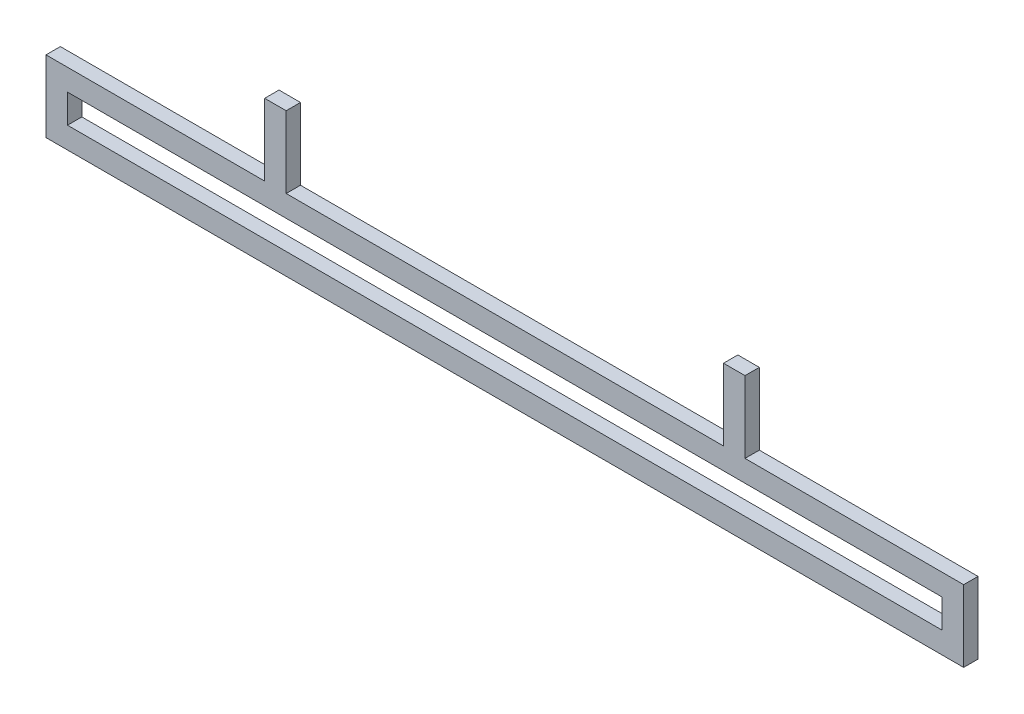
ISO-10303-21;
HEADER;
FILE_DESCRIPTION(('STEP AP214'),'2;1');
FILE_NAME('part.step','',(''),(''),'','','');
FILE_SCHEMA(('AUTOMOTIVE_DESIGN { 1 0 10303 214 1 1 1 1 }'));
ENDSEC;
DATA;
#1=APPLICATION_CONTEXT('core data for automotive mechanical design processes');
#2=APPLICATION_PROTOCOL_DEFINITION('international standard','automotive_design',2000,#1);
#3=PRODUCT_CONTEXT('',#1,'mechanical');
#4=PRODUCT('Part','Part','',(#3));
#5=PRODUCT_RELATED_PRODUCT_CATEGORY('part','',(#4));
#6=PRODUCT_DEFINITION_FORMATION('','',#4);
#7=PRODUCT_DEFINITION_CONTEXT('part definition',#1,'design');
#8=PRODUCT_DEFINITION('design','',#6,#7);
#9=PRODUCT_DEFINITION_SHAPE('','',#8);
#10=(LENGTH_UNIT() NAMED_UNIT(*) SI_UNIT(.MILLI.,.METRE.));
#11=(NAMED_UNIT(*) PLANE_ANGLE_UNIT() SI_UNIT($,.RADIAN.));
#12=(NAMED_UNIT(*) SI_UNIT($,.STERADIAN.) SOLID_ANGLE_UNIT());
#13=UNCERTAINTY_MEASURE_WITH_UNIT(LENGTH_MEASURE(1.E-05),#10,'distance_accuracy_value','');
#14=(GEOMETRIC_REPRESENTATION_CONTEXT(3) GLOBAL_UNCERTAINTY_ASSIGNED_CONTEXT((#13)) GLOBAL_UNIT_ASSIGNED_CONTEXT((#10,
#11,#12)) REPRESENTATION_CONTEXT('',''));
#15=CARTESIAN_POINT('',(0.,0.,0.));
#16=DIRECTION('',(0.,0.,1.));
#17=DIRECTION('',(1.,0.,0.));
#18=AXIS2_PLACEMENT_3D('',#15,#16,#17);
#19=CARTESIAN_POINT('',(0.,0.,10.));
#20=DIRECTION('',(0.,0.,1.));
#21=DIRECTION('',(1.,0.,0.));
#22=AXIS2_PLACEMENT_3D('',#19,#20,#21);
#23=PLANE('',#22);
#24=DIRECTION('',(0.,1.,0.));
#25=VECTOR('',#24,1.);
#26=CARTESIAN_POINT('',(0.,-145.36,10.));
#27=LINE('',#26,#25);
#28=CARTESIAN_POINT('',(0.,-145.36,10.));
#29=VERTEX_POINT('',#28);
#30=CARTESIAN_POINT('',(0.,-95.3599999999997,10.));
#31=VERTEX_POINT('',#30);
#32=EDGE_CURVE('E236',#29,#31,#27,.T.);
#33=ORIENTED_EDGE('',*,*,#32,.T.);
#34=DIRECTION('',(-1.,0.,0.));
#35=VECTOR('',#34,1.);
#36=CARTESIAN_POINT('',(0.,-95.3599999999997,10.));
#37=LINE('',#36,#35);
#38=CARTESIAN_POINT('',(-152.5,-95.3599999999997,10.));
#39=VERTEX_POINT('',#38);
#40=EDGE_CURVE('E241',#31,#39,#37,.T.);
#41=ORIENTED_EDGE('',*,*,#40,.T.);
#42=DIRECTION('',(0.,1.,0.));
#43=VECTOR('',#42,1.);
#44=CARTESIAN_POINT('',(-152.5,0.,10.));
#45=LINE('',#44,#43);
#46=CARTESIAN_POINT('',(-152.5,-45.3599999999996,10.));
#47=VERTEX_POINT('',#46);
#48=EDGE_CURVE('E213',#39,#47,#45,.T.);
#49=ORIENTED_EDGE('',*,*,#48,.T.);
#50=DIRECTION('',(-1.,0.,0.));
#51=VECTOR('',#50,1.);
#52=CARTESIAN_POINT('',(0.,-45.3599999999996,10.));
#53=LINE('',#52,#51);
#54=CARTESIAN_POINT('',(-167.5,-45.3599999999996,10.));
#55=VERTEX_POINT('',#54);
#56=EDGE_CURVE('E211',#47,#55,#53,.T.);
#57=ORIENTED_EDGE('',*,*,#56,.T.);
#58=DIRECTION('',(0.,1.,0.));
#59=VECTOR('',#58,1.);
#60=CARTESIAN_POINT('',(-167.5,0.,10.));
#61=LINE('',#60,#59);
#62=CARTESIAN_POINT('',(-167.5,-95.3599999999997,10.));
#63=VERTEX_POINT('',#62);
#64=EDGE_CURVE('E216',#63,#55,#61,.T.);
#65=ORIENTED_EDGE('',*,*,#64,.F.);
#66=CARTESIAN_POINT('',(-472.5,-95.3599999999997,10.));
#67=VERTEX_POINT('',#66);
#68=EDGE_CURVE('E245',#63,#67,#37,.T.);
#69=ORIENTED_EDGE('',*,*,#68,.T.);
#70=DIRECTION('',(0.,1.,0.));
#71=VECTOR('',#70,1.);
#72=CARTESIAN_POINT('',(-472.5,-95.3599999999997,10.));
#73=LINE('',#72,#71);
#74=CARTESIAN_POINT('',(-472.5,-45.3599999999996,10.));
#75=VERTEX_POINT('',#74);
#76=EDGE_CURVE('E207',#67,#75,#73,.T.);
#77=ORIENTED_EDGE('',*,*,#76,.T.);
#78=DIRECTION('',(1.,0.,0.));
#79=VECTOR('',#78,1.);
#80=CARTESIAN_POINT('',(-487.5,-45.3599999999996,10.));
#81=LINE('',#80,#79);
#82=CARTESIAN_POINT('',(-487.5,-45.3599999999996,10.));
#83=VERTEX_POINT('',#82);
#84=EDGE_CURVE('E198',#83,#75,#81,.T.);
#85=ORIENTED_EDGE('',*,*,#84,.F.);
#86=DIRECTION('',(0.,1.,0.));
#87=VECTOR('',#86,1.);
#88=CARTESIAN_POINT('',(-487.5,-95.3599999999997,10.));
#89=LINE('',#88,#87);
#90=CARTESIAN_POINT('',(-487.5,-95.3599999999997,10.));
#91=VERTEX_POINT('',#90);
#92=EDGE_CURVE('E186',#91,#83,#89,.T.);
#93=ORIENTED_EDGE('',*,*,#92,.F.);
#94=CARTESIAN_POINT('',(-640.,-95.3599999999997,10.));
#95=VERTEX_POINT('',#94);
#96=EDGE_CURVE('E239',#91,#95,#37,.T.);
#97=ORIENTED_EDGE('',*,*,#96,.T.);
#98=DIRECTION('',(0.,-1.,0.));
#99=VECTOR('',#98,1.);
#100=CARTESIAN_POINT('',(-640.,-145.36,10.));
#101=LINE('',#100,#99);
#102=CARTESIAN_POINT('',(-640.,-145.36,10.));
#103=VERTEX_POINT('',#102);
#104=EDGE_CURVE('E244',#95,#103,#101,.T.);
#105=ORIENTED_EDGE('',*,*,#104,.T.);
#106=DIRECTION('',(1.,0.,0.));
#107=VECTOR('',#106,1.);
#108=CARTESIAN_POINT('',(0.,-145.36,10.));
#109=LINE('',#108,#107);
#110=EDGE_CURVE('E247',#103,#29,#109,.T.);
#111=ORIENTED_EDGE('',*,*,#110,.T.);
#112=EDGE_LOOP('',(#33,#41,#49,#57,#65,#69,#77,#85,#93,#97,#105,#111));
#113=FACE_BOUND('',#112,.T.);
#114=DIRECTION('',(0.,-1.,0.));
#115=VECTOR('',#114,1.);
#116=CARTESIAN_POINT('',(-15.,-110.36,10.));
#117=LINE('',#116,#115);
#118=CARTESIAN_POINT('',(-15.,-110.36,10.));
#119=VERTEX_POINT('',#118);
#120=CARTESIAN_POINT('',(-15.,-130.36,10.));
#121=VERTEX_POINT('',#120);
#122=EDGE_CURVE('E157',#119,#121,#117,.T.);
#123=ORIENTED_EDGE('',*,*,#122,.T.);
#124=DIRECTION('',(1.,0.,0.));
#125=VECTOR('',#124,1.);
#126=CARTESIAN_POINT('',(-625.,-130.36,10.));
#127=LINE('',#126,#125);
#128=CARTESIAN_POINT('',(-625.,-130.36,10.));
#129=VERTEX_POINT('',#128);
#130=EDGE_CURVE('E148',#129,#121,#127,.T.);
#131=ORIENTED_EDGE('',*,*,#130,.F.);
#132=DIRECTION('',(0.,-1.,0.));
#133=VECTOR('',#132,1.);
#134=CARTESIAN_POINT('',(-625.,-110.36,10.));
#135=LINE('',#134,#133);
#136=CARTESIAN_POINT('',(-625.,-110.36,10.));
#137=VERTEX_POINT('',#136);
#138=EDGE_CURVE('E169',#137,#129,#135,.T.);
#139=ORIENTED_EDGE('',*,*,#138,.F.);
#140=DIRECTION('',(1.,0.,0.));
#141=VECTOR('',#140,1.);
#142=CARTESIAN_POINT('',(-625.,-110.36,10.));
#143=LINE('',#142,#141);
#144=EDGE_CURVE('E51',#137,#119,#143,.T.);
#145=ORIENTED_EDGE('',*,*,#144,.T.);
#146=EDGE_LOOP('',(#123,#131,#139,#145));
#147=FACE_BOUND('',#146,.T.);
#148=ADVANCED_FACE('F36',(#113,#147),#23,.T.);
#149=CARTESIAN_POINT('',(0.,0.,0.));
#150=DIRECTION('',(0.,0.,1.));
#151=DIRECTION('',(1.,0.,0.));
#152=AXIS2_PLACEMENT_3D('',#149,#150,#151);
#153=PLANE('',#152);
#154=DIRECTION('',(0.,1.,0.));
#155=VECTOR('',#154,1.);
#156=CARTESIAN_POINT('',(0.,-145.36,0.));
#157=LINE('',#156,#155);
#158=CARTESIAN_POINT('',(0.,-145.36,0.));
#159=VERTEX_POINT('',#158);
#160=CARTESIAN_POINT('',(0.,-95.3599999999997,0.));
#161=VERTEX_POINT('',#160);
#162=EDGE_CURVE('E228',#159,#161,#157,.T.);
#163=ORIENTED_EDGE('',*,*,#162,.F.);
#164=DIRECTION('',(1.,0.,0.));
#165=VECTOR('',#164,1.);
#166=CARTESIAN_POINT('',(0.,-145.36,0.));
#167=LINE('',#166,#165);
#168=CARTESIAN_POINT('',(-640.,-145.36,0.));
#169=VERTEX_POINT('',#168);
#170=EDGE_CURVE('E240',#169,#159,#167,.T.);
#171=ORIENTED_EDGE('',*,*,#170,.F.);
#172=DIRECTION('',(0.,-1.,0.));
#173=VECTOR('',#172,1.);
#174=CARTESIAN_POINT('',(-640.,-145.36,0.));
#175=LINE('',#174,#173);
#176=CARTESIAN_POINT('',(-640.,-95.3599999999997,0.));
#177=VERTEX_POINT('',#176);
#178=EDGE_CURVE('E256',#177,#169,#175,.T.);
#179=ORIENTED_EDGE('',*,*,#178,.F.);
#180=DIRECTION('',(-1.,0.,0.));
#181=VECTOR('',#180,1.);
#182=CARTESIAN_POINT('',(0.,-95.3599999999997,0.));
#183=LINE('',#182,#181);
#184=CARTESIAN_POINT('',(-487.5,-95.3599999999997,0.));
#185=VERTEX_POINT('',#184);
#186=EDGE_CURVE('E252',#185,#177,#183,.T.);
#187=ORIENTED_EDGE('',*,*,#186,.F.);
#188=DIRECTION('',(0.,1.,0.));
#189=VECTOR('',#188,1.);
#190=CARTESIAN_POINT('',(-487.5,-95.3599999999997,0.));
#191=LINE('',#190,#189);
#192=CARTESIAN_POINT('',(-487.5,-45.3599999999996,0.));
#193=VERTEX_POINT('',#192);
#194=EDGE_CURVE('E194',#185,#193,#191,.T.);
#195=ORIENTED_EDGE('',*,*,#194,.T.);
#196=DIRECTION('',(1.,0.,0.));
#197=VECTOR('',#196,1.);
#198=CARTESIAN_POINT('',(-487.5,-45.3599999999996,0.));
#199=LINE('',#198,#197);
#200=CARTESIAN_POINT('',(-472.5,-45.3599999999996,0.));
#201=VERTEX_POINT('',#200);
#202=EDGE_CURVE('E201',#193,#201,#199,.T.);
#203=ORIENTED_EDGE('',*,*,#202,.T.);
#204=DIRECTION('',(0.,1.,0.));
#205=VECTOR('',#204,1.);
#206=CARTESIAN_POINT('',(-472.5,-95.3599999999997,0.));
#207=LINE('',#206,#205);
#208=CARTESIAN_POINT('',(-472.5,-95.3599999999997,0.));
#209=VERTEX_POINT('',#208);
#210=EDGE_CURVE('E197',#209,#201,#207,.T.);
#211=ORIENTED_EDGE('',*,*,#210,.F.);
#212=CARTESIAN_POINT('',(-167.5,-95.3599999999997,0.));
#213=VERTEX_POINT('',#212);
#214=EDGE_CURVE('E257',#213,#209,#183,.T.);
#215=ORIENTED_EDGE('',*,*,#214,.F.);
#216=DIRECTION('',(0.,1.,0.));
#217=VECTOR('',#216,1.);
#218=CARTESIAN_POINT('',(-167.5,0.,0.));
#219=LINE('',#218,#217);
#220=CARTESIAN_POINT('',(-167.5,-45.3599999999996,0.));
#221=VERTEX_POINT('',#220);
#222=EDGE_CURVE('E214',#213,#221,#219,.T.);
#223=ORIENTED_EDGE('',*,*,#222,.T.);
#224=DIRECTION('',(-1.,0.,0.));
#225=VECTOR('',#224,1.);
#226=CARTESIAN_POINT('',(0.,-45.3599999999996,0.));
#227=LINE('',#226,#225);
#228=CARTESIAN_POINT('',(-152.5,-45.3599999999996,0.));
#229=VERTEX_POINT('',#228);
#230=EDGE_CURVE('E204',#229,#221,#227,.T.);
#231=ORIENTED_EDGE('',*,*,#230,.F.);
#232=DIRECTION('',(0.,1.,0.));
#233=VECTOR('',#232,1.);
#234=CARTESIAN_POINT('',(-152.5,0.,0.));
#235=LINE('',#234,#233);
#236=CARTESIAN_POINT('',(-152.5,-95.3599999999997,0.));
#237=VERTEX_POINT('',#236);
#238=EDGE_CURVE('E222',#237,#229,#235,.T.);
#239=ORIENTED_EDGE('',*,*,#238,.F.);
#240=EDGE_CURVE('E253',#161,#237,#183,.T.);
#241=ORIENTED_EDGE('',*,*,#240,.F.);
#242=EDGE_LOOP('',(#163,#171,#179,#187,#195,#203,#211,#215,#223,#231,#239,#241));
#243=FACE_BOUND('',#242,.T.);
#244=DIRECTION('',(1.,0.,0.));
#245=VECTOR('',#244,1.);
#246=CARTESIAN_POINT('',(-625.,-130.36,0.));
#247=LINE('',#246,#245);
#248=CARTESIAN_POINT('',(-625.,-130.36,0.));
#249=VERTEX_POINT('',#248);
#250=CARTESIAN_POINT('',(-15.,-130.36,0.));
#251=VERTEX_POINT('',#250);
#252=EDGE_CURVE('E59',#249,#251,#247,.T.);
#253=ORIENTED_EDGE('',*,*,#252,.T.);
#254=DIRECTION('',(0.,-1.,0.));
#255=VECTOR('',#254,1.);
#256=CARTESIAN_POINT('',(-15.,-110.36,0.));
#257=LINE('',#256,#255);
#258=CARTESIAN_POINT('',(-15.,-110.36,0.));
#259=VERTEX_POINT('',#258);
#260=EDGE_CURVE('E164',#259,#251,#257,.T.);
#261=ORIENTED_EDGE('',*,*,#260,.F.);
#262=DIRECTION('',(1.,0.,0.));
#263=VECTOR('',#262,1.);
#264=CARTESIAN_POINT('',(-625.,-110.36,0.));
#265=LINE('',#264,#263);
#266=CARTESIAN_POINT('',(-625.,-110.36,0.));
#267=VERTEX_POINT('',#266);
#268=EDGE_CURVE('E175',#267,#259,#265,.T.);
#269=ORIENTED_EDGE('',*,*,#268,.F.);
#270=DIRECTION('',(0.,-1.,0.));
#271=VECTOR('',#270,1.);
#272=CARTESIAN_POINT('',(-625.,-110.36,0.));
#273=LINE('',#272,#271);
#274=EDGE_CURVE('E158',#267,#249,#273,.T.);
#275=ORIENTED_EDGE('',*,*,#274,.T.);
#276=EDGE_LOOP('',(#253,#261,#269,#275));
#277=FACE_BOUND('',#276,.T.);
#278=ADVANCED_FACE('F275',(#243,#277),#153,.F.);
#279=CARTESIAN_POINT('',(0.,-95.3599999999997,10.));
#280=DIRECTION('',(0.,-1.,0.));
#281=DIRECTION('',(1.,0.,0.));
#282=AXIS2_PLACEMENT_3D('',#279,#280,#281);
#283=PLANE('',#282);
#284=DIRECTION('',(0.,0.,-1.));
#285=VECTOR('',#284,1.);
#286=CARTESIAN_POINT('',(-472.5,-95.3599999999997,10.));
#287=LINE('',#286,#285);
#288=EDGE_CURVE('E187',#67,#209,#287,.T.);
#289=ORIENTED_EDGE('',*,*,#288,.F.);
#290=ORIENTED_EDGE('',*,*,#68,.F.);
#291=DIRECTION('',(0.,0.,-1.));
#292=VECTOR('',#291,1.);
#293=CARTESIAN_POINT('',(-167.5,-95.3599999999997,10.));
#294=LINE('',#293,#292);
#295=EDGE_CURVE('E229',#63,#213,#294,.T.);
#296=ORIENTED_EDGE('',*,*,#295,.T.);
#297=ORIENTED_EDGE('',*,*,#214,.T.);
#298=EDGE_LOOP('',(#289,#290,#296,#297));
#299=FACE_BOUND('',#298,.T.);
#300=ADVANCED_FACE('F305',(#299),#283,.F.);
#301=DIRECTION('',(0.,0.,-1.));
#302=VECTOR('',#301,1.);
#303=CARTESIAN_POINT('',(-152.5,-95.3599999999997,10.));
#304=LINE('',#303,#302);
#305=EDGE_CURVE('E232',#39,#237,#304,.T.);
#306=ORIENTED_EDGE('',*,*,#305,.F.);
#307=ORIENTED_EDGE('',*,*,#40,.F.);
#308=DIRECTION('',(0.,0.,-1.));
#309=VECTOR('',#308,1.);
#310=CARTESIAN_POINT('',(0.,-95.3599999999997,10.));
#311=LINE('',#310,#309);
#312=EDGE_CURVE('E11',#31,#161,#311,.T.);
#313=ORIENTED_EDGE('',*,*,#312,.T.);
#314=ORIENTED_EDGE('',*,*,#240,.T.);
#315=EDGE_LOOP('',(#306,#307,#313,#314));
#316=FACE_BOUND('',#315,.T.);
#317=ADVANCED_FACE('F319',(#316),#283,.F.);
#318=CARTESIAN_POINT('',(0.,-145.36,10.));
#319=DIRECTION('',(-1.,0.,0.));
#320=DIRECTION('',(0.,0.,1.));
#321=AXIS2_PLACEMENT_3D('',#318,#319,#320);
#322=PLANE('',#321);
#323=ORIENTED_EDGE('',*,*,#162,.T.);
#324=ORIENTED_EDGE('',*,*,#312,.F.);
#325=ORIENTED_EDGE('',*,*,#32,.F.);
#326=DIRECTION('',(0.,0.,-1.));
#327=VECTOR('',#326,1.);
#328=CARTESIAN_POINT('',(0.,-145.36,10.));
#329=LINE('',#328,#327);
#330=EDGE_CURVE('E249',#29,#159,#329,.T.);
#331=ORIENTED_EDGE('',*,*,#330,.T.);
#332=EDGE_LOOP('',(#323,#324,#325,#331));
#333=FACE_BOUND('',#332,.T.);
#334=ADVANCED_FACE('F38',(#333),#322,.F.);
#335=ORIENTED_EDGE('',*,*,#96,.F.);
#336=DIRECTION('',(0.,0.,-1.));
#337=VECTOR('',#336,1.);
#338=CARTESIAN_POINT('',(-487.5,-95.3599999999997,10.));
#339=LINE('',#338,#337);
#340=EDGE_CURVE('E190',#91,#185,#339,.T.);
#341=ORIENTED_EDGE('',*,*,#340,.T.);
#342=ORIENTED_EDGE('',*,*,#186,.T.);
#343=DIRECTION('',(0.,0.,-1.));
#344=VECTOR('',#343,1.);
#345=CARTESIAN_POINT('',(-640.,-95.3599999999997,10.));
#346=LINE('',#345,#344);
#347=EDGE_CURVE('E44',#95,#177,#346,.T.);
#348=ORIENTED_EDGE('',*,*,#347,.F.);
#349=EDGE_LOOP('',(#335,#341,#342,#348));
#350=FACE_BOUND('',#349,.T.);
#351=ADVANCED_FACE('F303',(#350),#283,.F.);
#352=CARTESIAN_POINT('',(-640.,-145.36,10.));
#353=DIRECTION('',(1.,0.,0.));
#354=DIRECTION('',(0.,0.,-1.));
#355=AXIS2_PLACEMENT_3D('',#352,#353,#354);
#356=PLANE('',#355);
#357=ORIENTED_EDGE('',*,*,#178,.T.);
#358=DIRECTION('',(0.,0.,-1.));
#359=VECTOR('',#358,1.);
#360=CARTESIAN_POINT('',(-640.,-145.36,10.));
#361=LINE('',#360,#359);
#362=EDGE_CURVE('E262',#103,#169,#361,.T.);
#363=ORIENTED_EDGE('',*,*,#362,.F.);
#364=ORIENTED_EDGE('',*,*,#104,.F.);
#365=ORIENTED_EDGE('',*,*,#347,.T.);
#366=EDGE_LOOP('',(#357,#363,#364,#365));
#367=FACE_BOUND('',#366,.T.);
#368=ADVANCED_FACE('F269',(#367),#356,.F.);
#369=CARTESIAN_POINT('',(0.,-145.36,10.));
#370=DIRECTION('',(0.,1.,0.));
#371=DIRECTION('',(-1.,0.,0.));
#372=AXIS2_PLACEMENT_3D('',#369,#370,#371);
#373=PLANE('',#372);
#374=ORIENTED_EDGE('',*,*,#170,.T.);
#375=ORIENTED_EDGE('',*,*,#330,.F.);
#376=ORIENTED_EDGE('',*,*,#110,.F.);
#377=ORIENTED_EDGE('',*,*,#362,.T.);
#378=EDGE_LOOP('',(#374,#375,#376,#377));
#379=FACE_BOUND('',#378,.T.);
#380=ADVANCED_FACE('F279',(#379),#373,.F.);
#381=CARTESIAN_POINT('',(0.,-45.3599999999996,10.));
#382=DIRECTION('',(0.,-1.,0.));
#383=DIRECTION('',(0.,0.,-1.));
#384=AXIS2_PLACEMENT_3D('',#381,#382,#383);
#385=PLANE('',#384);
#386=ORIENTED_EDGE('',*,*,#230,.T.);
#387=DIRECTION('',(0.,0.,-1.));
#388=VECTOR('',#387,1.);
#389=CARTESIAN_POINT('',(-167.5,-45.3599999999996,10.));
#390=LINE('',#389,#388);
#391=EDGE_CURVE('E226',#55,#221,#390,.T.);
#392=ORIENTED_EDGE('',*,*,#391,.F.);
#393=ORIENTED_EDGE('',*,*,#56,.F.);
#394=DIRECTION('',(0.,0.,-1.));
#395=VECTOR('',#394,1.);
#396=CARTESIAN_POINT('',(-152.5,-45.3599999999996,10.));
#397=LINE('',#396,#395);
#398=EDGE_CURVE('E219',#47,#229,#397,.T.);
#399=ORIENTED_EDGE('',*,*,#398,.T.);
#400=EDGE_LOOP('',(#386,#392,#393,#399));
#401=FACE_BOUND('',#400,.T.);
#402=ADVANCED_FACE('F313',(#401),#385,.F.);
#403=CARTESIAN_POINT('',(-167.5,0.,10.));
#404=DIRECTION('',(-1.,0.,0.));
#405=DIRECTION('',(0.,0.,1.));
#406=AXIS2_PLACEMENT_3D('',#403,#404,#405);
#407=PLANE('',#406);
#408=ORIENTED_EDGE('',*,*,#222,.F.);
#409=ORIENTED_EDGE('',*,*,#295,.F.);
#410=ORIENTED_EDGE('',*,*,#64,.T.);
#411=ORIENTED_EDGE('',*,*,#391,.T.);
#412=EDGE_LOOP('',(#408,#409,#410,#411));
#413=FACE_BOUND('',#412,.T.);
#414=ADVANCED_FACE('F309',(#413),#407,.T.);
#415=CARTESIAN_POINT('',(-152.5,0.,10.));
#416=DIRECTION('',(-1.,0.,0.));
#417=DIRECTION('',(0.,0.,1.));
#418=AXIS2_PLACEMENT_3D('',#415,#416,#417);
#419=PLANE('',#418);
#420=ORIENTED_EDGE('',*,*,#238,.T.);
#421=ORIENTED_EDGE('',*,*,#398,.F.);
#422=ORIENTED_EDGE('',*,*,#48,.F.);
#423=ORIENTED_EDGE('',*,*,#305,.T.);
#424=EDGE_LOOP('',(#420,#421,#422,#423));
#425=FACE_BOUND('',#424,.T.);
#426=ADVANCED_FACE('F316',(#425),#419,.F.);
#427=CARTESIAN_POINT('',(-487.5,-45.3599999999996,10.));
#428=DIRECTION('',(0.,1.,0.));
#429=DIRECTION('',(0.,0.,1.));
#430=AXIS2_PLACEMENT_3D('',#427,#428,#429);
#431=PLANE('',#430);
#432=ORIENTED_EDGE('',*,*,#202,.F.);
#433=DIRECTION('',(0.,0.,-1.));
#434=VECTOR('',#433,1.);
#435=CARTESIAN_POINT('',(-487.5,-45.3599999999996,10.));
#436=LINE('',#435,#434);
#437=EDGE_CURVE('E165',#83,#193,#436,.T.);
#438=ORIENTED_EDGE('',*,*,#437,.F.);
#439=ORIENTED_EDGE('',*,*,#84,.T.);
#440=DIRECTION('',(0.,0.,-1.));
#441=VECTOR('',#440,1.);
#442=CARTESIAN_POINT('',(-472.5,-45.3599999999996,10.));
#443=LINE('',#442,#441);
#444=EDGE_CURVE('E184',#75,#201,#443,.T.);
#445=ORIENTED_EDGE('',*,*,#444,.T.);
#446=EDGE_LOOP('',(#432,#438,#439,#445));
#447=FACE_BOUND('',#446,.T.);
#448=ADVANCED_FACE('F299',(#447),#431,.T.);
#449=CARTESIAN_POINT('',(-487.5,-95.3599999999997,10.));
#450=DIRECTION('',(-1.,0.,0.));
#451=DIRECTION('',(0.,0.,1.));
#452=AXIS2_PLACEMENT_3D('',#449,#450,#451);
#453=PLANE('',#452);
#454=ORIENTED_EDGE('',*,*,#194,.F.);
#455=ORIENTED_EDGE('',*,*,#340,.F.);
#456=ORIENTED_EDGE('',*,*,#92,.T.);
#457=ORIENTED_EDGE('',*,*,#437,.T.);
#458=EDGE_LOOP('',(#454,#455,#456,#457));
#459=FACE_BOUND('',#458,.T.);
#460=ADVANCED_FACE('F302',(#459),#453,.T.);
#461=CARTESIAN_POINT('',(-472.5,-95.3599999999997,10.));
#462=DIRECTION('',(-1.,0.,0.));
#463=DIRECTION('',(0.,0.,1.));
#464=AXIS2_PLACEMENT_3D('',#461,#462,#463);
#465=PLANE('',#464);
#466=ORIENTED_EDGE('',*,*,#210,.T.);
#467=ORIENTED_EDGE('',*,*,#444,.F.);
#468=ORIENTED_EDGE('',*,*,#76,.F.);
#469=ORIENTED_EDGE('',*,*,#288,.T.);
#470=EDGE_LOOP('',(#466,#467,#468,#469));
#471=FACE_BOUND('',#470,.T.);
#472=ADVANCED_FACE('F295',(#471),#465,.F.);
#473=CARTESIAN_POINT('',(-625.,-130.36,10.));
#474=DIRECTION('',(0.,1.,0.));
#475=DIRECTION('',(-1.,0.,0.));
#476=AXIS2_PLACEMENT_3D('',#473,#474,#475);
#477=PLANE('',#476);
#478=ORIENTED_EDGE('',*,*,#252,.F.);
#479=DIRECTION('',(0.,0.,-1.));
#480=VECTOR('',#479,1.);
#481=CARTESIAN_POINT('',(-625.,-130.36,10.));
#482=LINE('',#481,#480);
#483=EDGE_CURVE('E153',#129,#249,#482,.T.);
#484=ORIENTED_EDGE('',*,*,#483,.F.);
#485=ORIENTED_EDGE('',*,*,#130,.T.);
#486=DIRECTION('',(0.,0.,-1.));
#487=VECTOR('',#486,1.);
#488=CARTESIAN_POINT('',(-15.,-130.36,10.));
#489=LINE('',#488,#487);
#490=EDGE_CURVE('E151',#121,#251,#489,.T.);
#491=ORIENTED_EDGE('',*,*,#490,.T.);
#492=EDGE_LOOP('',(#478,#484,#485,#491));
#493=FACE_BOUND('',#492,.T.);
#494=ADVANCED_FACE('F150',(#493),#477,.T.);
#495=CARTESIAN_POINT('',(-15.,-110.36,10.));
#496=DIRECTION('',(1.,0.,0.));
#497=DIRECTION('',(0.,1.,0.));
#498=AXIS2_PLACEMENT_3D('',#495,#496,#497);
#499=PLANE('',#498);
#500=ORIENTED_EDGE('',*,*,#260,.T.);
#501=ORIENTED_EDGE('',*,*,#490,.F.);
#502=ORIENTED_EDGE('',*,*,#122,.F.);
#503=DIRECTION('',(0.,0.,-1.));
#504=VECTOR('',#503,1.);
#505=CARTESIAN_POINT('',(-15.,-110.36,10.));
#506=LINE('',#505,#504);
#507=EDGE_CURVE('E166',#119,#259,#506,.T.);
#508=ORIENTED_EDGE('',*,*,#507,.T.);
#509=EDGE_LOOP('',(#500,#501,#502,#508));
#510=FACE_BOUND('',#509,.T.);
#511=ADVANCED_FACE('F162',(#510),#499,.F.);
#512=CARTESIAN_POINT('',(-625.,-110.36,10.));
#513=DIRECTION('',(0.,1.,0.));
#514=DIRECTION('',(-1.,0.,0.));
#515=AXIS2_PLACEMENT_3D('',#512,#513,#514);
#516=PLANE('',#515);
#517=ORIENTED_EDGE('',*,*,#268,.T.);
#518=ORIENTED_EDGE('',*,*,#507,.F.);
#519=ORIENTED_EDGE('',*,*,#144,.F.);
#520=DIRECTION('',(0.,0.,-1.));
#521=VECTOR('',#520,1.);
#522=CARTESIAN_POINT('',(-625.,-110.36,10.));
#523=LINE('',#522,#521);
#524=EDGE_CURVE('E181',#137,#267,#523,.T.);
#525=ORIENTED_EDGE('',*,*,#524,.T.);
#526=EDGE_LOOP('',(#517,#518,#519,#525));
#527=FACE_BOUND('',#526,.T.);
#528=ADVANCED_FACE('F395',(#527),#516,.F.);
#529=CARTESIAN_POINT('',(-625.,-110.36,10.));
#530=DIRECTION('',(1.,0.,0.));
#531=DIRECTION('',(0.,0.,-1.));
#532=AXIS2_PLACEMENT_3D('',#529,#530,#531);
#533=PLANE('',#532);
#534=ORIENTED_EDGE('',*,*,#274,.F.);
#535=ORIENTED_EDGE('',*,*,#524,.F.);
#536=ORIENTED_EDGE('',*,*,#138,.T.);
#537=ORIENTED_EDGE('',*,*,#483,.T.);
#538=EDGE_LOOP('',(#534,#535,#536,#537));
#539=FACE_BOUND('',#538,.T.);
#540=ADVANCED_FACE('F402',(#539),#533,.T.);
#541=CLOSED_SHELL('',(#148,#278,#300,#317,#334,#351,#368,#380,#402,#414,#426,#448,#460,#472,
#494,#511,#528,#540));
#542=MANIFOLD_SOLID_BREP('B2',#541);
#543=ADVANCED_BREP_SHAPE_REPRESENTATION('',(#18,#542),#14);
#544=SHAPE_DEFINITION_REPRESENTATION(#9,#543);
ENDSEC;
END-ISO-10303-21;
